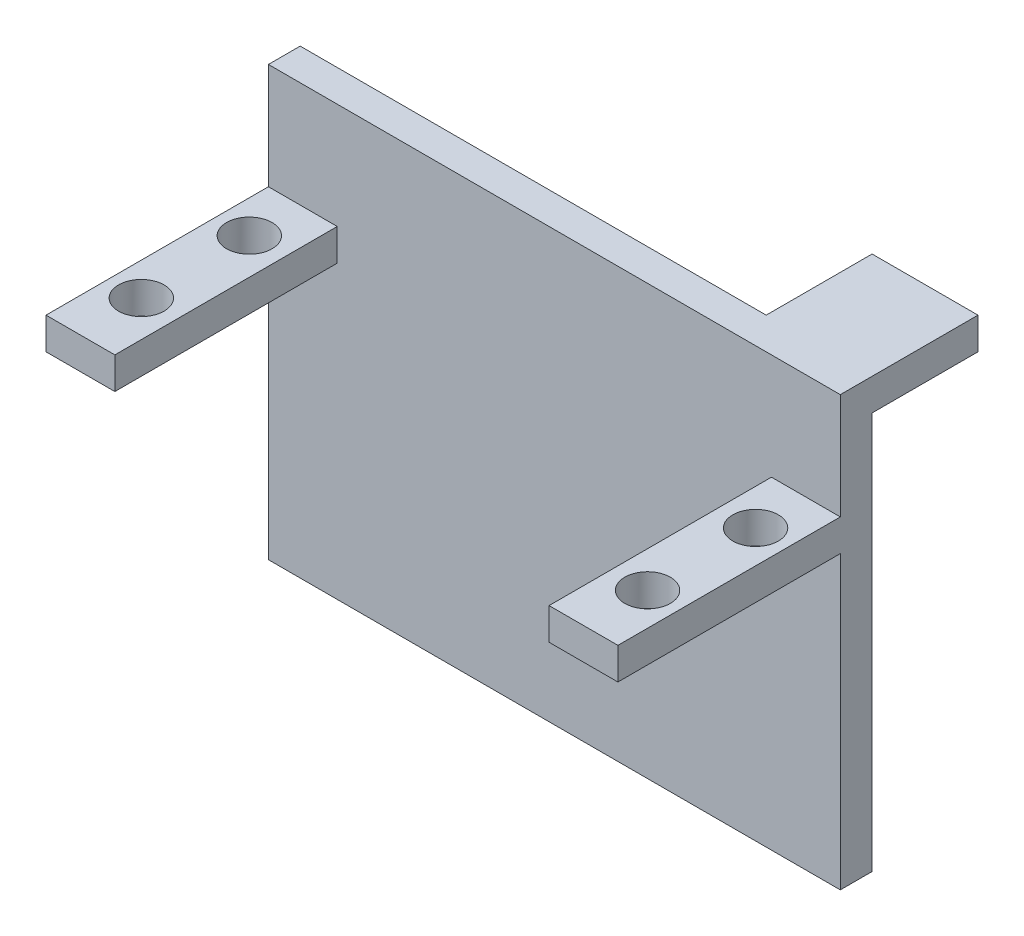
ISO-10303-21;
HEADER;
FILE_DESCRIPTION(('STEP AP214'),'2;1');
FILE_NAME('part.step','',(''),(''),'','','');
FILE_SCHEMA(('AUTOMOTIVE_DESIGN { 1 0 10303 214 1 1 1 1 }'));
ENDSEC;
DATA;
#1=APPLICATION_CONTEXT('core data for automotive mechanical design processes');
#2=APPLICATION_PROTOCOL_DEFINITION('international standard','automotive_design',2000,#1);
#3=PRODUCT_CONTEXT('',#1,'mechanical');
#4=PRODUCT('Part','Part','',(#3));
#5=PRODUCT_RELATED_PRODUCT_CATEGORY('part','',(#4));
#6=PRODUCT_DEFINITION_FORMATION('','',#4);
#7=PRODUCT_DEFINITION_CONTEXT('part definition',#1,'design');
#8=PRODUCT_DEFINITION('design','',#6,#7);
#9=PRODUCT_DEFINITION_SHAPE('','',#8);
#10=(LENGTH_UNIT() NAMED_UNIT(*) SI_UNIT(.MILLI.,.METRE.));
#11=(NAMED_UNIT(*) PLANE_ANGLE_UNIT() SI_UNIT($,.RADIAN.));
#12=(NAMED_UNIT(*) SI_UNIT($,.STERADIAN.) SOLID_ANGLE_UNIT());
#13=UNCERTAINTY_MEASURE_WITH_UNIT(LENGTH_MEASURE(1.E-05),#10,'distance_accuracy_value','');
#14=(GEOMETRIC_REPRESENTATION_CONTEXT(3) GLOBAL_UNCERTAINTY_ASSIGNED_CONTEXT((#13)) GLOBAL_UNIT_ASSIGNED_CONTEXT((#10,
#11,#12)) REPRESENTATION_CONTEXT('',''));
#15=CARTESIAN_POINT('',(0.,0.,0.));
#16=DIRECTION('',(0.,0.,1.));
#17=DIRECTION('',(1.,0.,0.));
#18=AXIS2_PLACEMENT_3D('',#15,#16,#17);
#19=CARTESIAN_POINT('',(0.,0.,3.));
#20=DIRECTION('',(0.,0.,1.));
#21=DIRECTION('',(1.,0.,0.));
#22=AXIS2_PLACEMENT_3D('',#19,#20,#21);
#23=PLANE('',#22);
#24=DIRECTION('',(0.,1.,0.));
#25=VECTOR('',#24,1.);
#26=CARTESIAN_POINT('',(-13.0588809187876,6.89252552595951,3.));
#27=LINE('',#26,#25);
#28=CARTESIAN_POINT('',(-13.0588809187876,3.89252552595951,3.));
#29=VERTEX_POINT('',#28);
#30=CARTESIAN_POINT('',(-13.0588809187876,6.89252552595951,3.));
#31=VERTEX_POINT('',#30);
#32=EDGE_CURVE('E169',#29,#31,#27,.T.);
#33=ORIENTED_EDGE('',*,*,#32,.F.);
#34=DIRECTION('',(1.,0.,0.));
#35=VECTOR('',#34,1.);
#36=CARTESIAN_POINT('',(-13.0588809187876,3.89252552595951,3.));
#37=LINE('',#36,#35);
#38=CARTESIAN_POINT('',(-19.5588809187876,3.89252552595951,3.));
#39=VERTEX_POINT('',#38);
#40=EDGE_CURVE('E166',#39,#29,#37,.T.);
#41=ORIENTED_EDGE('',*,*,#40,.F.);
#42=DIRECTION('',(0.,-1.,0.));
#43=VECTOR('',#42,1.);
#44=CARTESIAN_POINT('',(-19.5588809187876,16.8925255259596,3.));
#45=LINE('',#44,#43);
#46=CARTESIAN_POINT('',(-19.5588809187876,-23.6074744740404,3.));
#47=VERTEX_POINT('',#46);
#48=EDGE_CURVE('E235',#39,#47,#45,.T.);
#49=ORIENTED_EDGE('',*,*,#48,.T.);
#50=DIRECTION('',(1.,0.,0.));
#51=VECTOR('',#50,1.);
#52=CARTESIAN_POINT('',(-19.5588809187876,-23.6074744740404,3.));
#53=LINE('',#52,#51);
#54=CARTESIAN_POINT('',(34.4411190812124,-23.6074744740404,3.));
#55=VERTEX_POINT('',#54);
#56=EDGE_CURVE('E234',#47,#55,#53,.T.);
#57=ORIENTED_EDGE('',*,*,#56,.T.);
#58=DIRECTION('',(0.,1.,0.));
#59=VECTOR('',#58,1.);
#60=CARTESIAN_POINT('',(34.4411190812124,16.8925255259596,3.));
#61=LINE('',#60,#59);
#62=CARTESIAN_POINT('',(34.4411190812124,3.89252552595952,3.));
#63=VERTEX_POINT('',#62);
#64=EDGE_CURVE('E238',#55,#63,#61,.T.);
#65=ORIENTED_EDGE('',*,*,#64,.T.);
#66=DIRECTION('',(1.,0.,0.));
#67=VECTOR('',#66,1.);
#68=CARTESIAN_POINT('',(27.9411190812124,3.89252552595952,3.));
#69=LINE('',#68,#67);
#70=CARTESIAN_POINT('',(27.9411190812124,3.89252552595952,3.));
#71=VERTEX_POINT('',#70);
#72=EDGE_CURVE('E206',#71,#63,#69,.T.);
#73=ORIENTED_EDGE('',*,*,#72,.F.);
#74=DIRECTION('',(0.,-1.,0.));
#75=VECTOR('',#74,1.);
#76=CARTESIAN_POINT('',(27.9411190812124,6.89252552595952,3.));
#77=LINE('',#76,#75);
#78=CARTESIAN_POINT('',(27.9411190812124,6.89252552595952,3.));
#79=VERTEX_POINT('',#78);
#80=EDGE_CURVE('E215',#79,#71,#77,.T.);
#81=ORIENTED_EDGE('',*,*,#80,.F.);
#82=DIRECTION('',(-1.,0.,0.));
#83=VECTOR('',#82,1.);
#84=CARTESIAN_POINT('',(34.4411190812124,6.89252552595952,3.));
#85=LINE('',#84,#83);
#86=CARTESIAN_POINT('',(34.4411190812124,6.89252552595952,3.));
#87=VERTEX_POINT('',#86);
#88=EDGE_CURVE('E201',#87,#79,#85,.T.);
#89=ORIENTED_EDGE('',*,*,#88,.F.);
#90=CARTESIAN_POINT('',(34.4411190812124,16.8925255259596,3.));
#91=VERTEX_POINT('',#90);
#92=EDGE_CURVE('E237',#87,#91,#61,.T.);
#93=ORIENTED_EDGE('',*,*,#92,.T.);
#94=DIRECTION('',(-1.,0.,0.));
#95=VECTOR('',#94,1.);
#96=CARTESIAN_POINT('',(-19.5588809187876,16.8925255259596,3.));
#97=LINE('',#96,#95);
#98=CARTESIAN_POINT('',(-19.5588809187876,16.8925255259596,3.));
#99=VERTEX_POINT('',#98);
#100=EDGE_CURVE('E240',#91,#99,#97,.T.);
#101=ORIENTED_EDGE('',*,*,#100,.T.);
#102=CARTESIAN_POINT('',(-19.5588809187876,6.89252552595951,3.));
#103=VERTEX_POINT('',#102);
#104=EDGE_CURVE('E232',#99,#103,#45,.T.);
#105=ORIENTED_EDGE('',*,*,#104,.T.);
#106=DIRECTION('',(-1.,0.,0.));
#107=VECTOR('',#106,1.);
#108=CARTESIAN_POINT('',(-19.5588809187876,6.89252552595951,3.));
#109=LINE('',#108,#107);
#110=EDGE_CURVE('E179',#31,#103,#109,.T.);
#111=ORIENTED_EDGE('',*,*,#110,.F.);
#112=EDGE_LOOP('',(#33,#41,#49,#57,#65,#73,#81,#89,#93,#101,#105,#111));
#113=FACE_BOUND('',#112,.T.);
#114=ADVANCED_FACE('F34',(#113),#23,.T.);
#115=CARTESIAN_POINT('',(-19.5588809187876,16.8925255259596,3.));
#116=DIRECTION('',(1.,0.,0.));
#117=DIRECTION('',(0.,1.,0.));
#118=AXIS2_PLACEMENT_3D('',#115,#116,#117);
#119=PLANE('',#118);
#120=DIRECTION('',(0.,-1.,0.));
#121=VECTOR('',#120,1.);
#122=CARTESIAN_POINT('',(-19.5588809187876,16.8925255259596,0.));
#123=LINE('',#122,#121);
#124=CARTESIAN_POINT('',(-19.5588809187876,16.8925255259596,0.));
#125=VERTEX_POINT('',#124);
#126=CARTESIAN_POINT('',(-19.5588809187876,-23.6074744740404,0.));
#127=VERTEX_POINT('',#126);
#128=EDGE_CURVE('E231',#125,#127,#123,.T.);
#129=ORIENTED_EDGE('',*,*,#128,.T.);
#130=DIRECTION('',(0.,0.,-1.));
#131=VECTOR('',#130,1.);
#132=CARTESIAN_POINT('',(-19.5588809187876,-23.6074744740404,3.));
#133=LINE('',#132,#131);
#134=EDGE_CURVE('E11',#47,#127,#133,.T.);
#135=ORIENTED_EDGE('',*,*,#134,.F.);
#136=ORIENTED_EDGE('',*,*,#48,.F.);
#137=DIRECTION('',(0.,0.,-1.));
#138=VECTOR('',#137,1.);
#139=CARTESIAN_POINT('',(-19.5588809187876,3.89252552595951,24.));
#140=LINE('',#139,#138);
#141=CARTESIAN_POINT('',(-19.5588809187876,3.89252552595951,24.));
#142=VERTEX_POINT('',#141);
#143=EDGE_CURVE('E184',#142,#39,#140,.T.);
#144=ORIENTED_EDGE('',*,*,#143,.F.);
#145=DIRECTION('',(0.,-1.,0.));
#146=VECTOR('',#145,1.);
#147=CARTESIAN_POINT('',(-19.5588809187876,3.89252552595951,24.));
#148=LINE('',#147,#146);
#149=CARTESIAN_POINT('',(-19.5588809187876,6.89252552595951,24.));
#150=VERTEX_POINT('',#149);
#151=EDGE_CURVE('E183',#150,#142,#148,.T.);
#152=ORIENTED_EDGE('',*,*,#151,.F.);
#153=DIRECTION('',(0.,0.,-1.));
#154=VECTOR('',#153,1.);
#155=CARTESIAN_POINT('',(-19.5588809187876,6.89252552595951,24.));
#156=LINE('',#155,#154);
#157=EDGE_CURVE('E192',#150,#103,#156,.T.);
#158=ORIENTED_EDGE('',*,*,#157,.T.);
#159=ORIENTED_EDGE('',*,*,#104,.F.);
#160=DIRECTION('',(0.,0.,-1.));
#161=VECTOR('',#160,1.);
#162=CARTESIAN_POINT('',(-19.5588809187876,16.8925255259596,3.));
#163=LINE('',#162,#161);
#164=EDGE_CURVE('E242',#99,#125,#163,.T.);
#165=ORIENTED_EDGE('',*,*,#164,.T.);
#166=EDGE_LOOP('',(#129,#135,#136,#144,#152,#158,#159,#165));
#167=FACE_BOUND('',#166,.T.);
#168=ADVANCED_FACE('F36',(#167),#119,.F.);
#169=CARTESIAN_POINT('',(-19.5588809187876,-23.6074744740404,3.));
#170=DIRECTION('',(0.,1.,0.));
#171=DIRECTION('',(0.,0.,1.));
#172=AXIS2_PLACEMENT_3D('',#169,#170,#171);
#173=PLANE('',#172);
#174=DIRECTION('',(1.,0.,0.));
#175=VECTOR('',#174,1.);
#176=CARTESIAN_POINT('',(-19.5588809187876,-23.6074744740404,0.));
#177=LINE('',#176,#175);
#178=CARTESIAN_POINT('',(34.4411190812124,-23.6074744740404,0.));
#179=VERTEX_POINT('',#178);
#180=EDGE_CURVE('E245',#127,#179,#177,.T.);
#181=ORIENTED_EDGE('',*,*,#180,.T.);
#182=DIRECTION('',(0.,0.,-1.));
#183=VECTOR('',#182,1.);
#184=CARTESIAN_POINT('',(34.4411190812124,-23.6074744740404,3.));
#185=LINE('',#184,#183);
#186=EDGE_CURVE('E42',#55,#179,#185,.T.);
#187=ORIENTED_EDGE('',*,*,#186,.F.);
#188=ORIENTED_EDGE('',*,*,#56,.F.);
#189=ORIENTED_EDGE('',*,*,#134,.T.);
#190=EDGE_LOOP('',(#181,#187,#188,#189));
#191=FACE_BOUND('',#190,.T.);
#192=ADVANCED_FACE('F258',(#191),#173,.F.);
#193=CARTESIAN_POINT('',(34.4411190812124,16.8925255259596,3.));
#194=DIRECTION('',(-1.,0.,0.));
#195=DIRECTION('',(0.,-1.,0.));
#196=AXIS2_PLACEMENT_3D('',#193,#194,#195);
#197=PLANE('',#196);
#198=DIRECTION('',(0.,1.,0.));
#199=VECTOR('',#198,1.);
#200=CARTESIAN_POINT('',(34.4411190812124,16.8925255259596,0.));
#201=LINE('',#200,#199);
#202=CARTESIAN_POINT('',(34.4411190812124,13.8925255259596,0.));
#203=VERTEX_POINT('',#202);
#204=EDGE_CURVE('E165',#179,#203,#201,.T.);
#205=ORIENTED_EDGE('',*,*,#204,.T.);
#206=DIRECTION('',(0.,0.,1.));
#207=VECTOR('',#206,1.);
#208=CARTESIAN_POINT('',(34.4411190812124,13.8925255259595,-10.));
#209=LINE('',#208,#207);
#210=CARTESIAN_POINT('',(34.4411190812124,13.8925255259595,-10.));
#211=VERTEX_POINT('',#210);
#212=EDGE_CURVE('E145',#211,#203,#209,.T.);
#213=ORIENTED_EDGE('',*,*,#212,.F.);
#214=DIRECTION('',(0.,-1.,0.));
#215=VECTOR('',#214,1.);
#216=CARTESIAN_POINT('',(34.4411190812124,0.,-10.));
#217=LINE('',#216,#215);
#218=CARTESIAN_POINT('',(34.4411190812124,16.8925255259596,-10.));
#219=VERTEX_POINT('',#218);
#220=EDGE_CURVE('E152',#219,#211,#217,.T.);
#221=ORIENTED_EDGE('',*,*,#220,.F.);
#222=DIRECTION('',(0.,0.,-1.));
#223=VECTOR('',#222,1.);
#224=CARTESIAN_POINT('',(34.4411190812124,16.8925255259596,3.));
#225=LINE('',#224,#223);
#226=EDGE_CURVE('E251',#91,#219,#225,.T.);
#227=ORIENTED_EDGE('',*,*,#226,.F.);
#228=ORIENTED_EDGE('',*,*,#92,.F.);
#229=DIRECTION('',(0.,0.,-1.));
#230=VECTOR('',#229,1.);
#231=CARTESIAN_POINT('',(34.4411190812124,6.89252552595952,24.));
#232=LINE('',#231,#230);
#233=CARTESIAN_POINT('',(34.4411190812124,6.89252552595952,24.));
#234=VERTEX_POINT('',#233);
#235=EDGE_CURVE('E212',#234,#87,#232,.T.);
#236=ORIENTED_EDGE('',*,*,#235,.F.);
#237=DIRECTION('',(0.,1.,0.));
#238=VECTOR('',#237,1.);
#239=CARTESIAN_POINT('',(34.4411190812124,3.89252552595952,24.));
#240=LINE('',#239,#238);
#241=CARTESIAN_POINT('',(34.4411190812124,3.89252552595952,24.));
#242=VERTEX_POINT('',#241);
#243=EDGE_CURVE('E210',#242,#234,#240,.T.);
#244=ORIENTED_EDGE('',*,*,#243,.F.);
#245=DIRECTION('',(0.,0.,-1.));
#246=VECTOR('',#245,1.);
#247=CARTESIAN_POINT('',(34.4411190812124,3.89252552595952,24.));
#248=LINE('',#247,#246);
#249=EDGE_CURVE('E222',#242,#63,#248,.T.);
#250=ORIENTED_EDGE('',*,*,#249,.T.);
#251=ORIENTED_EDGE('',*,*,#64,.F.);
#252=ORIENTED_EDGE('',*,*,#186,.T.);
#253=EDGE_LOOP('',(#205,#213,#221,#227,#228,#236,#244,#250,#251,#252));
#254=FACE_BOUND('',#253,.T.);
#255=ADVANCED_FACE('F163',(#254),#197,.F.);
#256=CARTESIAN_POINT('',(-19.5588809187876,16.8925255259596,3.));
#257=DIRECTION('',(0.,-1.,0.));
#258=DIRECTION('',(1.,0.,0.));
#259=AXIS2_PLACEMENT_3D('',#256,#257,#258);
#260=PLANE('',#259);
#261=ORIENTED_EDGE('',*,*,#226,.T.);
#262=DIRECTION('',(1.,0.,0.));
#263=VECTOR('',#262,1.);
#264=CARTESIAN_POINT('',(0.,16.8925255259596,-10.));
#265=LINE('',#264,#263);
#266=CARTESIAN_POINT('',(24.4411190812124,16.8925255259596,-10.));
#267=VERTEX_POINT('',#266);
#268=EDGE_CURVE('E158',#267,#219,#265,.T.);
#269=ORIENTED_EDGE('',*,*,#268,.F.);
#270=DIRECTION('',(0.,0.,1.));
#271=VECTOR('',#270,1.);
#272=CARTESIAN_POINT('',(24.4411190812124,16.8925255259596,-10.));
#273=LINE('',#272,#271);
#274=CARTESIAN_POINT('',(24.4411190812124,16.8925255259596,0.));
#275=VERTEX_POINT('',#274);
#276=EDGE_CURVE('E171',#267,#275,#273,.T.);
#277=ORIENTED_EDGE('',*,*,#276,.T.);
#278=DIRECTION('',(-1.,0.,0.));
#279=VECTOR('',#278,1.);
#280=CARTESIAN_POINT('',(-19.5588809187876,16.8925255259596,0.));
#281=LINE('',#280,#279);
#282=EDGE_CURVE('E55',#275,#125,#281,.T.);
#283=ORIENTED_EDGE('',*,*,#282,.T.);
#284=ORIENTED_EDGE('',*,*,#164,.F.);
#285=ORIENTED_EDGE('',*,*,#100,.F.);
#286=EDGE_LOOP('',(#261,#269,#277,#283,#284,#285));
#287=FACE_BOUND('',#286,.T.);
#288=ADVANCED_FACE('F264',(#287),#260,.F.);
#289=CARTESIAN_POINT('',(0.,0.,0.));
#290=DIRECTION('',(0.,0.,1.));
#291=DIRECTION('',(1.,0.,0.));
#292=AXIS2_PLACEMENT_3D('',#289,#290,#291);
#293=PLANE('',#292);
#294=ORIENTED_EDGE('',*,*,#282,.F.);
#295=DIRECTION('',(0.,-1.,0.));
#296=VECTOR('',#295,1.);
#297=CARTESIAN_POINT('',(24.4411190812124,0.,0.));
#298=LINE('',#297,#296);
#299=CARTESIAN_POINT('',(24.4411190812124,13.8925255259596,0.));
#300=VERTEX_POINT('',#299);
#301=EDGE_CURVE('E161',#275,#300,#298,.T.);
#302=ORIENTED_EDGE('',*,*,#301,.T.);
#303=DIRECTION('',(-1.,0.,0.));
#304=VECTOR('',#303,1.);
#305=CARTESIAN_POINT('',(0.,13.8925255259596,0.));
#306=LINE('',#305,#304);
#307=EDGE_CURVE('E49',#203,#300,#306,.T.);
#308=ORIENTED_EDGE('',*,*,#307,.F.);
#309=ORIENTED_EDGE('',*,*,#204,.F.);
#310=ORIENTED_EDGE('',*,*,#180,.F.);
#311=ORIENTED_EDGE('',*,*,#128,.F.);
#312=EDGE_LOOP('',(#294,#302,#308,#309,#310,#311));
#313=FACE_BOUND('',#312,.T.);
#314=ADVANCED_FACE('F256',(#313),#293,.F.);
#315=CARTESIAN_POINT('',(34.4411190812124,6.89252552595952,24.));
#316=DIRECTION('',(0.,-1.,0.));
#317=DIRECTION('',(0.,0.,-1.));
#318=AXIS2_PLACEMENT_3D('',#315,#316,#317);
#319=PLANE('',#318);
#320=CARTESIAN_POINT('',(31.3411190812124,6.89252552595952,7.9));
#321=DIRECTION('',(0.,1.,0.));
#322=DIRECTION('',(0.,0.,1.));
#323=AXIS2_PLACEMENT_3D('',#320,#321,#322);
#324=CIRCLE('',#323,2.14999999999999);
#325=CARTESIAN_POINT('',(31.3411190812124,6.89252552595952,10.05));
#326=VERTEX_POINT('',#325);
#327=EDGE_CURVE('E283',#326,#326,#324,.T.);
#328=ORIENTED_EDGE('',*,*,#327,.F.);
#329=EDGE_LOOP('',(#328));
#330=FACE_BOUND('',#329,.T.);
#331=CARTESIAN_POINT('',(31.3411190812124,6.89252552595952,18.1));
#332=DIRECTION('',(0.,1.,0.));
#333=DIRECTION('',(0.,0.,1.));
#334=AXIS2_PLACEMENT_3D('',#331,#332,#333);
#335=CIRCLE('',#334,2.15);
#336=CARTESIAN_POINT('',(31.3411190812124,6.89252552595952,20.25));
#337=VERTEX_POINT('',#336);
#338=EDGE_CURVE('E276',#337,#337,#335,.T.);
#339=ORIENTED_EDGE('',*,*,#338,.F.);
#340=EDGE_LOOP('',(#339));
#341=FACE_BOUND('',#340,.T.);
#342=ORIENTED_EDGE('',*,*,#88,.T.);
#343=DIRECTION('',(0.,0.,-1.));
#344=VECTOR('',#343,1.);
#345=CARTESIAN_POINT('',(27.9411190812124,6.89252552595952,24.));
#346=LINE('',#345,#344);
#347=CARTESIAN_POINT('',(27.9411190812124,6.89252552595952,24.));
#348=VERTEX_POINT('',#347);
#349=EDGE_CURVE('E228',#348,#79,#346,.T.);
#350=ORIENTED_EDGE('',*,*,#349,.F.);
#351=DIRECTION('',(-1.,0.,0.));
#352=VECTOR('',#351,1.);
#353=CARTESIAN_POINT('',(34.4411190812124,6.89252552595952,24.));
#354=LINE('',#353,#352);
#355=EDGE_CURVE('E202',#234,#348,#354,.T.);
#356=ORIENTED_EDGE('',*,*,#355,.F.);
#357=ORIENTED_EDGE('',*,*,#235,.T.);
#358=EDGE_LOOP('',(#342,#350,#356,#357));
#359=FACE_BOUND('',#358,.T.);
#360=ADVANCED_FACE('F341',(#330,#341,#359),#319,.F.);
#361=CARTESIAN_POINT('',(27.9411190812124,6.89252552595952,24.));
#362=DIRECTION('',(1.,0.,0.));
#363=DIRECTION('',(0.,1.,0.));
#364=AXIS2_PLACEMENT_3D('',#361,#362,#363);
#365=PLANE('',#364);
#366=ORIENTED_EDGE('',*,*,#80,.T.);
#367=DIRECTION('',(0.,0.,-1.));
#368=VECTOR('',#367,1.);
#369=CARTESIAN_POINT('',(27.9411190812124,3.89252552595952,24.));
#370=LINE('',#369,#368);
#371=CARTESIAN_POINT('',(27.9411190812124,3.89252552595952,24.));
#372=VERTEX_POINT('',#371);
#373=EDGE_CURVE('E225',#372,#71,#370,.T.);
#374=ORIENTED_EDGE('',*,*,#373,.F.);
#375=DIRECTION('',(0.,-1.,0.));
#376=VECTOR('',#375,1.);
#377=CARTESIAN_POINT('',(27.9411190812124,6.89252552595952,24.));
#378=LINE('',#377,#376);
#379=EDGE_CURVE('E205',#348,#372,#378,.T.);
#380=ORIENTED_EDGE('',*,*,#379,.F.);
#381=ORIENTED_EDGE('',*,*,#349,.T.);
#382=EDGE_LOOP('',(#366,#374,#380,#381));
#383=FACE_BOUND('',#382,.T.);
#384=ADVANCED_FACE('F373',(#383),#365,.F.);
#385=CARTESIAN_POINT('',(27.9411190812124,3.89252552595952,24.));
#386=DIRECTION('',(0.,1.,0.));
#387=DIRECTION('',(0.,0.,1.));
#388=AXIS2_PLACEMENT_3D('',#385,#386,#387);
#389=PLANE('',#388);
#390=CARTESIAN_POINT('',(31.3411190812124,3.89252552595952,7.9));
#391=DIRECTION('',(0.,1.,0.));
#392=DIRECTION('',(-1.,0.,0.));
#393=AXIS2_PLACEMENT_3D('',#390,#391,#392);
#394=CIRCLE('',#393,2.14999999999999);
#395=CARTESIAN_POINT('',(29.1911190812124,3.89252552595952,7.9));
#396=VERTEX_POINT('',#395);
#397=EDGE_CURVE('E279',#396,#396,#394,.F.);
#398=ORIENTED_EDGE('',*,*,#397,.F.);
#399=EDGE_LOOP('',(#398));
#400=FACE_BOUND('',#399,.T.);
#401=CARTESIAN_POINT('',(31.3411190812124,3.89252552595952,18.1));
#402=DIRECTION('',(0.,1.,0.));
#403=DIRECTION('',(-1.,0.,0.));
#404=AXIS2_PLACEMENT_3D('',#401,#402,#403);
#405=CIRCLE('',#404,2.15);
#406=CARTESIAN_POINT('',(29.1911190812124,3.89252552595952,18.1));
#407=VERTEX_POINT('',#406);
#408=EDGE_CURVE('E269',#407,#407,#405,.F.);
#409=ORIENTED_EDGE('',*,*,#408,.F.);
#410=EDGE_LOOP('',(#409));
#411=FACE_BOUND('',#410,.T.);
#412=ORIENTED_EDGE('',*,*,#72,.T.);
#413=ORIENTED_EDGE('',*,*,#249,.F.);
#414=DIRECTION('',(1.,0.,0.));
#415=VECTOR('',#414,1.);
#416=CARTESIAN_POINT('',(27.9411190812124,3.89252552595952,24.));
#417=LINE('',#416,#415);
#418=EDGE_CURVE('E208',#372,#242,#417,.T.);
#419=ORIENTED_EDGE('',*,*,#418,.F.);
#420=ORIENTED_EDGE('',*,*,#373,.T.);
#421=EDGE_LOOP('',(#412,#413,#419,#420));
#422=FACE_BOUND('',#421,.T.);
#423=ADVANCED_FACE('F329',(#400,#411,#422),#389,.F.);
#424=CARTESIAN_POINT('',(0.,0.,24.));
#425=DIRECTION('',(0.,0.,1.));
#426=DIRECTION('',(1.,0.,0.));
#427=AXIS2_PLACEMENT_3D('',#424,#425,#426);
#428=PLANE('',#427);
#429=ORIENTED_EDGE('',*,*,#355,.T.);
#430=ORIENTED_EDGE('',*,*,#379,.T.);
#431=ORIENTED_EDGE('',*,*,#418,.T.);
#432=ORIENTED_EDGE('',*,*,#243,.T.);
#433=EDGE_LOOP('',(#429,#430,#431,#432));
#434=FACE_BOUND('',#433,.T.);
#435=ADVANCED_FACE('F321',(#434),#428,.T.);
#436=CARTESIAN_POINT('',(-13.0588809187876,3.89252552595951,24.));
#437=DIRECTION('',(0.,1.,0.));
#438=DIRECTION('',(-1.,0.,0.));
#439=AXIS2_PLACEMENT_3D('',#436,#437,#438);
#440=PLANE('',#439);
#441=CARTESIAN_POINT('',(-16.4588809187876,3.89252552595951,18.1));
#442=DIRECTION('',(0.,1.,0.));
#443=DIRECTION('',(-1.,0.,0.));
#444=AXIS2_PLACEMENT_3D('',#441,#442,#443);
#445=CIRCLE('',#444,2.15);
#446=CARTESIAN_POINT('',(-18.6088809187876,3.89252552595951,18.1));
#447=VERTEX_POINT('',#446);
#448=EDGE_CURVE('E280',#447,#447,#445,.F.);
#449=ORIENTED_EDGE('',*,*,#448,.F.);
#450=EDGE_LOOP('',(#449));
#451=FACE_BOUND('',#450,.T.);
#452=CARTESIAN_POINT('',(-16.4588809187876,3.89252552595951,7.90000000000005));
#453=DIRECTION('',(0.,1.,0.));
#454=DIRECTION('',(-1.,0.,0.));
#455=AXIS2_PLACEMENT_3D('',#452,#453,#454);
#456=CIRCLE('',#455,2.15);
#457=CARTESIAN_POINT('',(-18.6088809187876,3.89252552595951,7.90000000000005));
#458=VERTEX_POINT('',#457);
#459=EDGE_CURVE('E287',#458,#458,#456,.F.);
#460=ORIENTED_EDGE('',*,*,#459,.F.);
#461=EDGE_LOOP('',(#460));
#462=FACE_BOUND('',#461,.T.);
#463=ORIENTED_EDGE('',*,*,#40,.T.);
#464=DIRECTION('',(0.,0.,-1.));
#465=VECTOR('',#464,1.);
#466=CARTESIAN_POINT('',(-13.0588809187876,3.89252552595951,24.));
#467=LINE('',#466,#465);
#468=CARTESIAN_POINT('',(-13.0588809187876,3.89252552595951,24.));
#469=VERTEX_POINT('',#468);
#470=EDGE_CURVE('E198',#469,#29,#467,.T.);
#471=ORIENTED_EDGE('',*,*,#470,.F.);
#472=DIRECTION('',(1.,0.,0.));
#473=VECTOR('',#472,1.);
#474=CARTESIAN_POINT('',(-13.0588809187876,3.89252552595951,24.));
#475=LINE('',#474,#473);
#476=EDGE_CURVE('E175',#142,#469,#475,.T.);
#477=ORIENTED_EDGE('',*,*,#476,.F.);
#478=ORIENTED_EDGE('',*,*,#143,.T.);
#479=EDGE_LOOP('',(#463,#471,#477,#478));
#480=FACE_BOUND('',#479,.T.);
#481=ADVANCED_FACE('F319',(#451,#462,#480),#440,.F.);
#482=CARTESIAN_POINT('',(-13.0588809187876,6.89252552595951,24.));
#483=DIRECTION('',(-1.,0.,0.));
#484=DIRECTION('',(0.,-1.,0.));
#485=AXIS2_PLACEMENT_3D('',#482,#483,#484);
#486=PLANE('',#485);
#487=ORIENTED_EDGE('',*,*,#32,.T.);
#488=DIRECTION('',(0.,0.,-1.));
#489=VECTOR('',#488,1.);
#490=CARTESIAN_POINT('',(-13.0588809187876,6.89252552595951,24.));
#491=LINE('',#490,#489);
#492=CARTESIAN_POINT('',(-13.0588809187876,6.89252552595951,24.));
#493=VERTEX_POINT('',#492);
#494=EDGE_CURVE('E195',#493,#31,#491,.T.);
#495=ORIENTED_EDGE('',*,*,#494,.F.);
#496=DIRECTION('',(0.,1.,0.));
#497=VECTOR('',#496,1.);
#498=CARTESIAN_POINT('',(-13.0588809187876,6.89252552595951,24.));
#499=LINE('',#498,#497);
#500=EDGE_CURVE('E178',#469,#493,#499,.T.);
#501=ORIENTED_EDGE('',*,*,#500,.F.);
#502=ORIENTED_EDGE('',*,*,#470,.T.);
#503=EDGE_LOOP('',(#487,#495,#501,#502));
#504=FACE_BOUND('',#503,.T.);
#505=ADVANCED_FACE('F304',(#504),#486,.F.);
#506=CARTESIAN_POINT('',(-19.5588809187876,6.89252552595951,24.));
#507=DIRECTION('',(0.,-1.,0.));
#508=DIRECTION('',(1.,0.,0.));
#509=AXIS2_PLACEMENT_3D('',#506,#507,#508);
#510=PLANE('',#509);
#511=CARTESIAN_POINT('',(-16.4588809187876,6.89252552595952,18.1));
#512=DIRECTION('',(0.,1.,0.));
#513=DIRECTION('',(0.,0.,1.));
#514=AXIS2_PLACEMENT_3D('',#511,#512,#513);
#515=CIRCLE('',#514,2.15);
#516=CARTESIAN_POINT('',(-16.4588809187876,6.89252552595952,20.25));
#517=VERTEX_POINT('',#516);
#518=EDGE_CURVE('E284',#517,#517,#515,.T.);
#519=ORIENTED_EDGE('',*,*,#518,.F.);
#520=EDGE_LOOP('',(#519));
#521=FACE_BOUND('',#520,.T.);
#522=CARTESIAN_POINT('',(-16.4588809187876,6.89252552595952,7.90000000000005));
#523=DIRECTION('',(0.,1.,0.));
#524=DIRECTION('',(0.,0.,1.));
#525=AXIS2_PLACEMENT_3D('',#522,#523,#524);
#526=CIRCLE('',#525,2.15);
#527=CARTESIAN_POINT('',(-16.4588809187876,6.89252552595952,10.0500000000001));
#528=VERTEX_POINT('',#527);
#529=EDGE_CURVE('E294',#528,#528,#526,.T.);
#530=ORIENTED_EDGE('',*,*,#529,.F.);
#531=EDGE_LOOP('',(#530));
#532=FACE_BOUND('',#531,.T.);
#533=ORIENTED_EDGE('',*,*,#110,.T.);
#534=ORIENTED_EDGE('',*,*,#157,.F.);
#535=DIRECTION('',(-1.,0.,0.));
#536=VECTOR('',#535,1.);
#537=CARTESIAN_POINT('',(-19.5588809187876,6.89252552595951,24.));
#538=LINE('',#537,#536);
#539=EDGE_CURVE('E181',#493,#150,#538,.T.);
#540=ORIENTED_EDGE('',*,*,#539,.F.);
#541=ORIENTED_EDGE('',*,*,#494,.T.);
#542=EDGE_LOOP('',(#533,#534,#540,#541));
#543=FACE_BOUND('',#542,.T.);
#544=ADVANCED_FACE('F300',(#521,#532,#543),#510,.F.);
#545=CARTESIAN_POINT('',(0.,0.,24.));
#546=DIRECTION('',(0.,0.,-1.));
#547=DIRECTION('',(-1.,0.,0.));
#548=AXIS2_PLACEMENT_3D('',#545,#546,#547);
#549=PLANE('',#548);
#550=ORIENTED_EDGE('',*,*,#476,.T.);
#551=ORIENTED_EDGE('',*,*,#500,.T.);
#552=ORIENTED_EDGE('',*,*,#539,.T.);
#553=ORIENTED_EDGE('',*,*,#151,.T.);
#554=EDGE_LOOP('',(#550,#551,#552,#553));
#555=FACE_BOUND('',#554,.T.);
#556=ADVANCED_FACE('F303',(#555),#549,.F.);
#557=CARTESIAN_POINT('',(0.,13.8925255259596,-10.));
#558=DIRECTION('',(0.,1.,0.));
#559=DIRECTION('',(-1.,0.,0.));
#560=AXIS2_PLACEMENT_3D('',#557,#558,#559);
#561=PLANE('',#560);
#562=ORIENTED_EDGE('',*,*,#307,.T.);
#563=DIRECTION('',(0.,0.,1.));
#564=VECTOR('',#563,1.);
#565=CARTESIAN_POINT('',(24.4411190812124,13.8925255259596,-10.));
#566=LINE('',#565,#564);
#567=CARTESIAN_POINT('',(24.4411190812124,13.8925255259596,-10.));
#568=VERTEX_POINT('',#567);
#569=EDGE_CURVE('E147',#568,#300,#566,.T.);
#570=ORIENTED_EDGE('',*,*,#569,.F.);
#571=DIRECTION('',(-1.,0.,0.));
#572=VECTOR('',#571,1.);
#573=CARTESIAN_POINT('',(0.,13.8925255259596,-10.));
#574=LINE('',#573,#572);
#575=EDGE_CURVE('E141',#211,#568,#574,.T.);
#576=ORIENTED_EDGE('',*,*,#575,.F.);
#577=ORIENTED_EDGE('',*,*,#212,.T.);
#578=EDGE_LOOP('',(#562,#570,#576,#577));
#579=FACE_BOUND('',#578,.T.);
#580=ADVANCED_FACE('F143',(#579),#561,.F.);
#581=CARTESIAN_POINT('',(24.4411190812124,0.,-10.));
#582=DIRECTION('',(-1.,0.,0.));
#583=DIRECTION('',(0.,0.,1.));
#584=AXIS2_PLACEMENT_3D('',#581,#582,#583);
#585=PLANE('',#584);
#586=ORIENTED_EDGE('',*,*,#301,.F.);
#587=ORIENTED_EDGE('',*,*,#276,.F.);
#588=DIRECTION('',(0.,-1.,0.));
#589=VECTOR('',#588,1.);
#590=CARTESIAN_POINT('',(24.4411190812124,0.,-10.));
#591=LINE('',#590,#589);
#592=EDGE_CURVE('E151',#267,#568,#591,.T.);
#593=ORIENTED_EDGE('',*,*,#592,.T.);
#594=ORIENTED_EDGE('',*,*,#569,.T.);
#595=EDGE_LOOP('',(#586,#587,#593,#594));
#596=FACE_BOUND('',#595,.T.);
#597=ADVANCED_FACE('F267',(#596),#585,.T.);
#598=CARTESIAN_POINT('',(0.,0.,-10.));
#599=DIRECTION('',(0.,0.,-1.));
#600=DIRECTION('',(-1.,0.,0.));
#601=AXIS2_PLACEMENT_3D('',#598,#599,#600);
#602=PLANE('',#601);
#603=ORIENTED_EDGE('',*,*,#220,.T.);
#604=ORIENTED_EDGE('',*,*,#575,.T.);
#605=ORIENTED_EDGE('',*,*,#592,.F.);
#606=ORIENTED_EDGE('',*,*,#268,.T.);
#607=EDGE_LOOP('',(#603,#604,#605,#606));
#608=FACE_BOUND('',#607,.T.);
#609=ADVANCED_FACE('F156',(#608),#602,.T.);
#610=CARTESIAN_POINT('',(-16.4588809187876,-2.1885927922448,7.90000000000005));
#611=DIRECTION('',(0.,1.,0.));
#612=DIRECTION('',(0.,0.,1.));
#613=AXIS2_PLACEMENT_3D('',#610,#611,#612);
#614=CYLINDRICAL_SURFACE('',#613,2.15);
#615=ORIENTED_EDGE('',*,*,#459,.T.);
#616=EDGE_LOOP('',(#615));
#617=FACE_BOUND('',#616,.T.);
#618=ORIENTED_EDGE('',*,*,#529,.T.);
#619=EDGE_LOOP('',(#618));
#620=FACE_BOUND('',#619,.T.);
#621=ADVANCED_FACE('F298',(#617,#620),#614,.F.);
#622=CARTESIAN_POINT('',(-16.4588809187876,-2.1885927922448,18.1));
#623=DIRECTION('',(0.,1.,0.));
#624=DIRECTION('',(0.,0.,1.));
#625=AXIS2_PLACEMENT_3D('',#622,#623,#624);
#626=CYLINDRICAL_SURFACE('',#625,2.15);
#627=ORIENTED_EDGE('',*,*,#448,.T.);
#628=EDGE_LOOP('',(#627));
#629=FACE_BOUND('',#628,.T.);
#630=ORIENTED_EDGE('',*,*,#518,.T.);
#631=EDGE_LOOP('',(#630));
#632=FACE_BOUND('',#631,.T.);
#633=ADVANCED_FACE('F434',(#629,#632),#626,.F.);
#634=CARTESIAN_POINT('',(31.3411190812124,-2.1885927922448,18.1));
#635=DIRECTION('',(0.,1.,0.));
#636=DIRECTION('',(0.,0.,1.));
#637=AXIS2_PLACEMENT_3D('',#634,#635,#636);
#638=CYLINDRICAL_SURFACE('',#637,2.15);
#639=ORIENTED_EDGE('',*,*,#408,.T.);
#640=EDGE_LOOP('',(#639));
#641=FACE_BOUND('',#640,.T.);
#642=ORIENTED_EDGE('',*,*,#338,.T.);
#643=EDGE_LOOP('',(#642));
#644=FACE_BOUND('',#643,.T.);
#645=ADVANCED_FACE('F442',(#641,#644),#638,.F.);
#646=CARTESIAN_POINT('',(31.3411190812124,-2.1885927922448,7.9));
#647=DIRECTION('',(0.,1.,0.));
#648=DIRECTION('',(0.,0.,1.));
#649=AXIS2_PLACEMENT_3D('',#646,#647,#648);
#650=CYLINDRICAL_SURFACE('',#649,2.14999999999999);
#651=ORIENTED_EDGE('',*,*,#397,.T.);
#652=EDGE_LOOP('',(#651));
#653=FACE_BOUND('',#652,.T.);
#654=ORIENTED_EDGE('',*,*,#327,.T.);
#655=EDGE_LOOP('',(#654));
#656=FACE_BOUND('',#655,.T.);
#657=ADVANCED_FACE('F450',(#653,#656),#650,.F.);
#658=CLOSED_SHELL('',(#114,#168,#192,#255,#288,#314,#360,#384,#423,#435,#481,#505,#544,#556,
#580,#597,#609,#621,#633,#645,#657));
#659=MANIFOLD_SOLID_BREP('B2',#658);
#660=ADVANCED_BREP_SHAPE_REPRESENTATION('',(#18,#659),#14);
#661=SHAPE_DEFINITION_REPRESENTATION(#9,#660);
ENDSEC;
END-ISO-10303-21;
